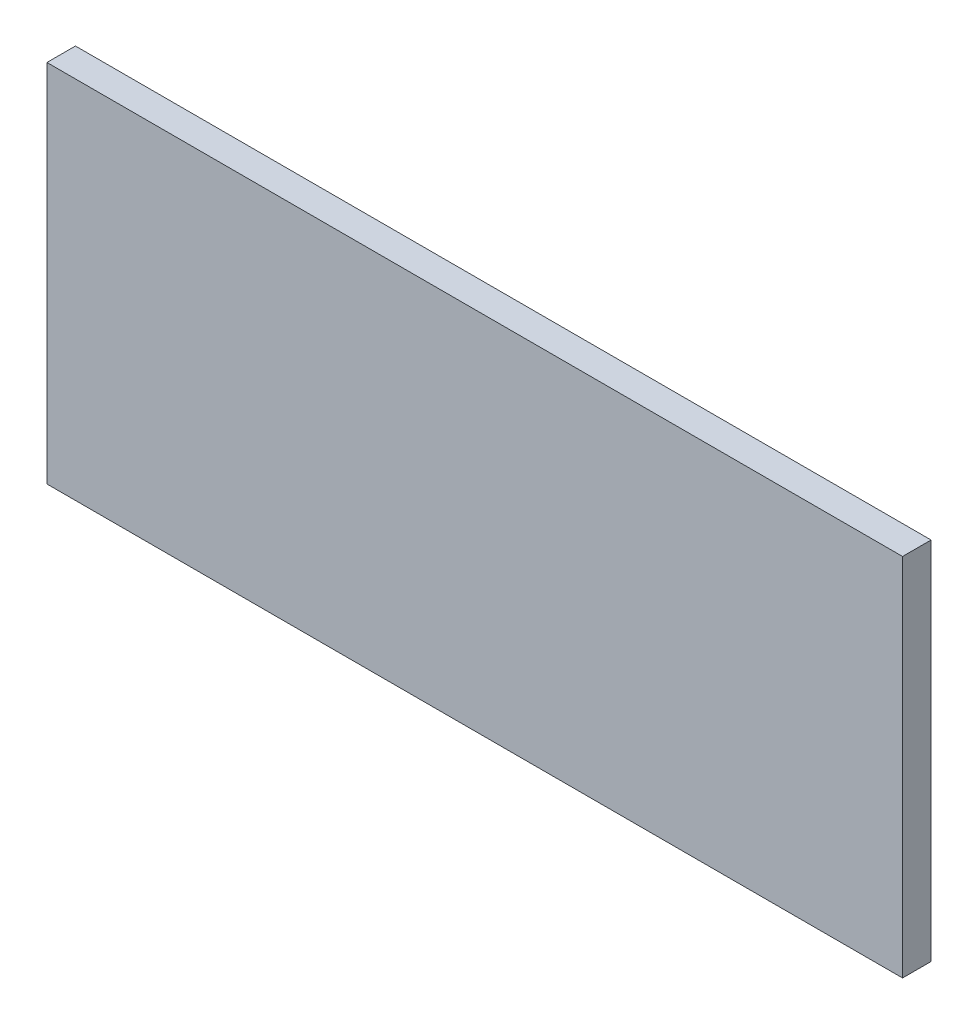
ISO-10303-21;
HEADER;
FILE_DESCRIPTION(('STEP AP214'),'2;1');
FILE_NAME('part.step','',(''),(''),'','','');
FILE_SCHEMA(('AUTOMOTIVE_DESIGN { 1 0 10303 214 1 1 1 1 }'));
ENDSEC;
DATA;
#1=APPLICATION_CONTEXT('core data for automotive mechanical design processes');
#2=APPLICATION_PROTOCOL_DEFINITION('international standard','automotive_design',2000,#1);
#3=PRODUCT_CONTEXT('',#1,'mechanical');
#4=PRODUCT('Part','Part','',(#3));
#5=PRODUCT_RELATED_PRODUCT_CATEGORY('part','',(#4));
#6=PRODUCT_DEFINITION_FORMATION('','',#4);
#7=PRODUCT_DEFINITION_CONTEXT('part definition',#1,'design');
#8=PRODUCT_DEFINITION('design','',#6,#7);
#9=PRODUCT_DEFINITION_SHAPE('','',#8);
#10=(LENGTH_UNIT() NAMED_UNIT(*) SI_UNIT(.MILLI.,.METRE.));
#11=(NAMED_UNIT(*) PLANE_ANGLE_UNIT() SI_UNIT($,.RADIAN.));
#12=(NAMED_UNIT(*) SI_UNIT($,.STERADIAN.) SOLID_ANGLE_UNIT());
#13=UNCERTAINTY_MEASURE_WITH_UNIT(LENGTH_MEASURE(1.E-05),#10,'distance_accuracy_value','');
#14=(GEOMETRIC_REPRESENTATION_CONTEXT(3) GLOBAL_UNCERTAINTY_ASSIGNED_CONTEXT((#13)) GLOBAL_UNIT_ASSIGNED_CONTEXT((#10,
#11,#12)) REPRESENTATION_CONTEXT('',''));
#15=CARTESIAN_POINT('',(0.,0.,0.));
#16=DIRECTION('',(0.,0.,1.));
#17=DIRECTION('',(1.,0.,0.));
#18=AXIS2_PLACEMENT_3D('',#15,#16,#17);
#19=CARTESIAN_POINT('',(-75.,32.,5.));
#20=DIRECTION('',(1.,0.,0.));
#21=DIRECTION('',(0.,0.,-1.));
#22=AXIS2_PLACEMENT_3D('',#19,#20,#21);
#23=PLANE('',#22);
#24=DIRECTION('',(0.,-1.,0.));
#25=VECTOR('',#24,1.);
#26=CARTESIAN_POINT('',(-75.,32.,0.));
#27=LINE('',#26,#25);
#28=CARTESIAN_POINT('',(-75.,32.,0.));
#29=VERTEX_POINT('',#28);
#30=CARTESIAN_POINT('',(-75.,-32.,0.));
#31=VERTEX_POINT('',#30);
#32=EDGE_CURVE('E96',#29,#31,#27,.T.);
#33=ORIENTED_EDGE('',*,*,#32,.T.);
#34=DIRECTION('',(0.,0.,-1.));
#35=VECTOR('',#34,1.);
#36=CARTESIAN_POINT('',(-75.,-32.,5.));
#37=LINE('',#36,#35);
#38=CARTESIAN_POINT('',(-75.,-32.,5.));
#39=VERTEX_POINT('',#38);
#40=EDGE_CURVE('E11',#39,#31,#37,.T.);
#41=ORIENTED_EDGE('',*,*,#40,.F.);
#42=DIRECTION('',(0.,-1.,0.));
#43=VECTOR('',#42,1.);
#44=CARTESIAN_POINT('',(-75.,32.,5.));
#45=LINE('',#44,#43);
#46=CARTESIAN_POINT('',(-75.,32.,5.));
#47=VERTEX_POINT('',#46);
#48=EDGE_CURVE('E84',#47,#39,#45,.T.);
#49=ORIENTED_EDGE('',*,*,#48,.F.);
#50=DIRECTION('',(0.,0.,-1.));
#51=VECTOR('',#50,1.);
#52=CARTESIAN_POINT('',(-75.,32.,5.));
#53=LINE('',#52,#51);
#54=EDGE_CURVE('E92',#47,#29,#53,.T.);
#55=ORIENTED_EDGE('',*,*,#54,.T.);
#56=EDGE_LOOP('',(#33,#41,#49,#55));
#57=FACE_BOUND('',#56,.T.);
#58=ADVANCED_FACE('F33',(#57),#23,.F.);
#59=CARTESIAN_POINT('',(-75.,-32.,5.));
#60=DIRECTION('',(0.,1.,0.));
#61=DIRECTION('',(0.,0.,1.));
#62=AXIS2_PLACEMENT_3D('',#59,#60,#61);
#63=PLANE('',#62);
#64=DIRECTION('',(1.,0.,0.));
#65=VECTOR('',#64,1.);
#66=CARTESIAN_POINT('',(-75.,-32.,0.));
#67=LINE('',#66,#65);
#68=CARTESIAN_POINT('',(75.,-32.,0.));
#69=VERTEX_POINT('',#68);
#70=EDGE_CURVE('E88',#31,#69,#67,.T.);
#71=ORIENTED_EDGE('',*,*,#70,.T.);
#72=DIRECTION('',(0.,0.,-1.));
#73=VECTOR('',#72,1.);
#74=CARTESIAN_POINT('',(75.,-32.,5.));
#75=LINE('',#74,#73);
#76=CARTESIAN_POINT('',(75.,-32.,5.));
#77=VERTEX_POINT('',#76);
#78=EDGE_CURVE('E41',#77,#69,#75,.T.);
#79=ORIENTED_EDGE('',*,*,#78,.F.);
#80=DIRECTION('',(1.,0.,0.));
#81=VECTOR('',#80,1.);
#82=CARTESIAN_POINT('',(-75.,-32.,5.));
#83=LINE('',#82,#81);
#84=EDGE_CURVE('E79',#39,#77,#83,.T.);
#85=ORIENTED_EDGE('',*,*,#84,.F.);
#86=ORIENTED_EDGE('',*,*,#40,.T.);
#87=EDGE_LOOP('',(#71,#79,#85,#86));
#88=FACE_BOUND('',#87,.T.);
#89=ADVANCED_FACE('F87',(#88),#63,.F.);
#90=CARTESIAN_POINT('',(75.,32.,5.));
#91=DIRECTION('',(-1.,0.,0.));
#92=DIRECTION('',(0.,0.,1.));
#93=AXIS2_PLACEMENT_3D('',#90,#91,#92);
#94=PLANE('',#93);
#95=DIRECTION('',(0.,1.,0.));
#96=VECTOR('',#95,1.);
#97=CARTESIAN_POINT('',(75.,32.,0.));
#98=LINE('',#97,#96);
#99=CARTESIAN_POINT('',(75.,32.,0.));
#100=VERTEX_POINT('',#99);
#101=EDGE_CURVE('E66',#69,#100,#98,.T.);
#102=ORIENTED_EDGE('',*,*,#101,.T.);
#103=DIRECTION('',(0.,0.,-1.));
#104=VECTOR('',#103,1.);
#105=CARTESIAN_POINT('',(75.,32.,5.));
#106=LINE('',#105,#104);
#107=CARTESIAN_POINT('',(75.,32.,5.));
#108=VERTEX_POINT('',#107);
#109=EDGE_CURVE('E89',#108,#100,#106,.T.);
#110=ORIENTED_EDGE('',*,*,#109,.F.);
#111=DIRECTION('',(0.,1.,0.));
#112=VECTOR('',#111,1.);
#113=CARTESIAN_POINT('',(75.,32.,5.));
#114=LINE('',#113,#112);
#115=EDGE_CURVE('E82',#77,#108,#114,.T.);
#116=ORIENTED_EDGE('',*,*,#115,.F.);
#117=ORIENTED_EDGE('',*,*,#78,.T.);
#118=EDGE_LOOP('',(#102,#110,#116,#117));
#119=FACE_BOUND('',#118,.T.);
#120=ADVANCED_FACE('F90',(#119),#94,.F.);
#121=CARTESIAN_POINT('',(-75.,32.,5.));
#122=DIRECTION('',(0.,-1.,0.));
#123=DIRECTION('',(1.,0.,0.));
#124=AXIS2_PLACEMENT_3D('',#121,#122,#123);
#125=PLANE('',#124);
#126=DIRECTION('',(-1.,0.,0.));
#127=VECTOR('',#126,1.);
#128=CARTESIAN_POINT('',(-75.,32.,0.));
#129=LINE('',#128,#127);
#130=EDGE_CURVE('E72',#100,#29,#129,.T.);
#131=ORIENTED_EDGE('',*,*,#130,.T.);
#132=ORIENTED_EDGE('',*,*,#54,.F.);
#133=DIRECTION('',(-1.,0.,0.));
#134=VECTOR('',#133,1.);
#135=CARTESIAN_POINT('',(-75.,32.,5.));
#136=LINE('',#135,#134);
#137=EDGE_CURVE('E49',#108,#47,#136,.T.);
#138=ORIENTED_EDGE('',*,*,#137,.F.);
#139=ORIENTED_EDGE('',*,*,#109,.T.);
#140=EDGE_LOOP('',(#131,#132,#138,#139));
#141=FACE_BOUND('',#140,.T.);
#142=ADVANCED_FACE('F103',(#141),#125,.F.);
#143=CARTESIAN_POINT('',(0.,0.,5.));
#144=DIRECTION('',(0.,0.,1.));
#145=DIRECTION('',(1.,0.,0.));
#146=AXIS2_PLACEMENT_3D('',#143,#144,#145);
#147=PLANE('',#146);
#148=ORIENTED_EDGE('',*,*,#48,.T.);
#149=ORIENTED_EDGE('',*,*,#84,.T.);
#150=ORIENTED_EDGE('',*,*,#115,.T.);
#151=ORIENTED_EDGE('',*,*,#137,.T.);
#152=EDGE_LOOP('',(#148,#149,#150,#151));
#153=FACE_BOUND('',#152,.T.);
#154=ADVANCED_FACE('F80',(#153),#147,.T.);
#155=CARTESIAN_POINT('',(0.,0.,0.));
#156=DIRECTION('',(0.,0.,1.));
#157=DIRECTION('',(1.,0.,0.));
#158=AXIS2_PLACEMENT_3D('',#155,#156,#157);
#159=PLANE('',#158);
#160=ORIENTED_EDGE('',*,*,#32,.F.);
#161=ORIENTED_EDGE('',*,*,#130,.F.);
#162=ORIENTED_EDGE('',*,*,#101,.F.);
#163=ORIENTED_EDGE('',*,*,#70,.F.);
#164=EDGE_LOOP('',(#160,#161,#162,#163));
#165=FACE_BOUND('',#164,.T.);
#166=ADVANCED_FACE('F106',(#165),#159,.F.);
#167=CLOSED_SHELL('',(#58,#89,#120,#142,#154,#166));
#168=MANIFOLD_SOLID_BREP('B2',#167);
#169=ADVANCED_BREP_SHAPE_REPRESENTATION('',(#18,#168),#14);
#170=SHAPE_DEFINITION_REPRESENTATION(#9,#169);
ENDSEC;
END-ISO-10303-21;
